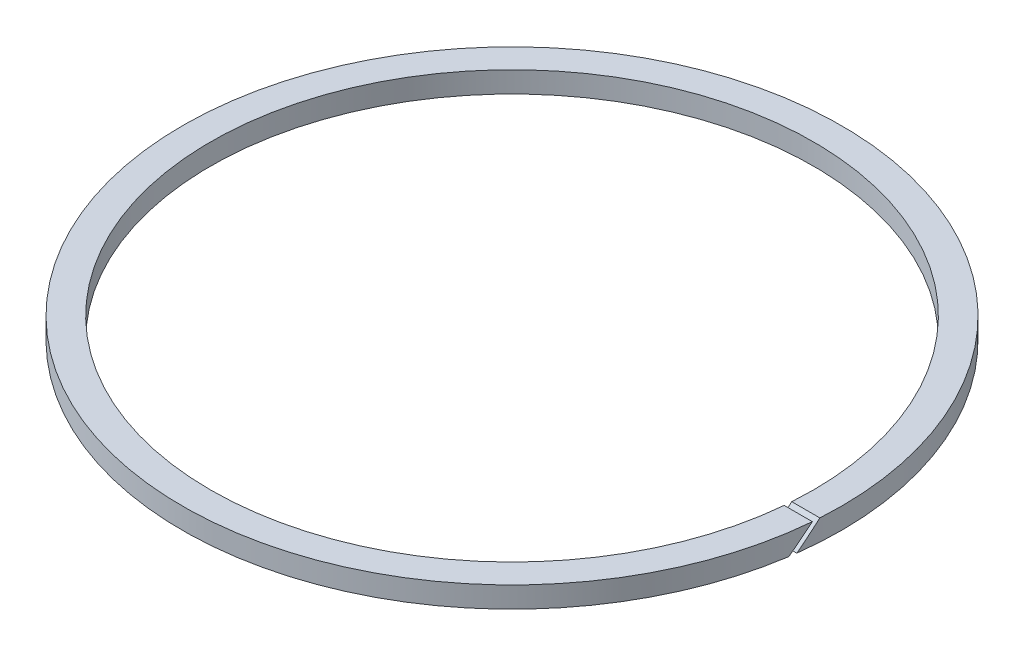
ISO-10303-21;
HEADER;
FILE_DESCRIPTION(('STEP AP214'),'2;1');
FILE_NAME('part.step','',(''),(''),'','','');
FILE_SCHEMA(('AUTOMOTIVE_DESIGN { 1 0 10303 214 1 1 1 1 }'));
ENDSEC;
DATA;
#1=APPLICATION_CONTEXT('core data for automotive mechanical design processes');
#2=APPLICATION_PROTOCOL_DEFINITION('international standard','automotive_design',2000,#1);
#3=PRODUCT_CONTEXT('',#1,'mechanical');
#4=PRODUCT('Part','Part','',(#3));
#5=PRODUCT_RELATED_PRODUCT_CATEGORY('part','',(#4));
#6=PRODUCT_DEFINITION_FORMATION('','',#4);
#7=PRODUCT_DEFINITION_CONTEXT('part definition',#1,'design');
#8=PRODUCT_DEFINITION('design','',#6,#7);
#9=PRODUCT_DEFINITION_SHAPE('','',#8);
#10=(LENGTH_UNIT() NAMED_UNIT(*) SI_UNIT(.MILLI.,.METRE.));
#11=(NAMED_UNIT(*) PLANE_ANGLE_UNIT() SI_UNIT($,.RADIAN.));
#12=(NAMED_UNIT(*) SI_UNIT($,.STERADIAN.) SOLID_ANGLE_UNIT());
#13=UNCERTAINTY_MEASURE_WITH_UNIT(LENGTH_MEASURE(1.E-05),#10,'distance_accuracy_value','');
#14=(GEOMETRIC_REPRESENTATION_CONTEXT(3) GLOBAL_UNCERTAINTY_ASSIGNED_CONTEXT((#13)) GLOBAL_UNIT_ASSIGNED_CONTEXT((#10,
#11,#12)) REPRESENTATION_CONTEXT('',''));
#15=CARTESIAN_POINT('',(0.,0.,0.));
#16=DIRECTION('',(0.,0.,1.));
#17=DIRECTION('',(1.,0.,0.));
#18=AXIS2_PLACEMENT_3D('',#15,#16,#17);
#19=CARTESIAN_POINT('',(0.,3.,0.));
#20=DIRECTION('',(0.,1.,0.));
#21=DIRECTION('',(0.,0.,1.));
#22=AXIS2_PLACEMENT_3D('',#19,#20,#21);
#23=PLANE('',#22);
#24=DIRECTION('',(1.,0.,0.));
#25=VECTOR('',#24,1.);
#26=CARTESIAN_POINT('',(37.,3.,3.));
#27=LINE('',#26,#25);
#28=CARTESIAN_POINT('',(42.8952211790545,3.,3.));
#29=VERTEX_POINT('',#28);
#30=CARTESIAN_POINT('',(46.9041575982343,3.,3.));
#31=VERTEX_POINT('',#30);
#32=EDGE_CURVE('E58',#29,#31,#27,.T.);
#33=ORIENTED_EDGE('',*,*,#32,.T.);
#34=CARTESIAN_POINT('',(0.,3.,0.));
#35=DIRECTION('',(0.,1.,0.));
#36=DIRECTION('',(0.,0.,1.));
#37=AXIS2_PLACEMENT_3D('',#34,#35,#36);
#38=CIRCLE('',#37,47.);
#39=CARTESIAN_POINT('',(46.8294778958724,3.,4.));
#40=VERTEX_POINT('',#39);
#41=EDGE_CURVE('E81',#31,#40,#38,.T.);
#42=ORIENTED_EDGE('',*,*,#41,.T.);
#43=DIRECTION('',(1.,0.,0.));
#44=VECTOR('',#43,1.);
#45=CARTESIAN_POINT('',(37.,3.,4.));
#46=LINE('',#45,#44);
#47=CARTESIAN_POINT('',(42.8135492572153,3.,4.));
#48=VERTEX_POINT('',#47);
#49=EDGE_CURVE('E75',#48,#40,#46,.T.);
#50=ORIENTED_EDGE('',*,*,#49,.F.);
#51=CARTESIAN_POINT('',(0.,3.,0.));
#52=DIRECTION('',(0.,1.,0.));
#53=DIRECTION('',(0.,0.,1.));
#54=AXIS2_PLACEMENT_3D('',#51,#52,#53);
#55=CIRCLE('',#54,43.);
#56=EDGE_CURVE('E85',#29,#48,#55,.T.);
#57=ORIENTED_EDGE('',*,*,#56,.F.);
#58=EDGE_LOOP('',(#33,#42,#50,#57));
#59=FACE_BOUND('',#58,.T.);
#60=ADVANCED_FACE('F36',(#59),#23,.T.);
#61=CARTESIAN_POINT('',(0.,0.,0.));
#62=DIRECTION('',(0.,1.,0.));
#63=DIRECTION('',(0.,0.,1.));
#64=AXIS2_PLACEMENT_3D('',#61,#62,#63);
#65=PLANE('',#64);
#66=CARTESIAN_POINT('',(0.,0.,0.));
#67=DIRECTION('',(0.,1.,0.));
#68=DIRECTION('',(0.,0.,1.));
#69=AXIS2_PLACEMENT_3D('',#66,#67,#68);
#70=CIRCLE('',#69,47.);
#71=CARTESIAN_POINT('',(46.6154480832267,0.,6.00000000000004));
#72=VERTEX_POINT('',#71);
#73=CARTESIAN_POINT('',(46.475800154489,0.,7.00000000000004));
#74=VERTEX_POINT('',#73);
#75=EDGE_CURVE('E89',#72,#74,#70,.T.);
#76=ORIENTED_EDGE('',*,*,#75,.F.);
#77=DIRECTION('',(1.,0.,0.));
#78=VECTOR('',#77,1.);
#79=CARTESIAN_POINT('',(37.,0.,6.00000000000004));
#80=LINE('',#79,#78);
#81=CARTESIAN_POINT('',(42.5793377120875,0.,6.00000000000004));
#82=VERTEX_POINT('',#81);
#83=EDGE_CURVE('E103',#82,#72,#80,.T.);
#84=ORIENTED_EDGE('',*,*,#83,.F.);
#85=CARTESIAN_POINT('',(0.,0.,0.));
#86=DIRECTION('',(0.,1.,0.));
#87=DIRECTION('',(0.,0.,1.));
#88=AXIS2_PLACEMENT_3D('',#85,#86,#87);
#89=CIRCLE('',#88,43.);
#90=CARTESIAN_POINT('',(42.4264068711929,0.,7.00000000000003));
#91=VERTEX_POINT('',#90);
#92=EDGE_CURVE('E90',#82,#91,#89,.T.);
#93=ORIENTED_EDGE('',*,*,#92,.T.);
#94=DIRECTION('',(1.,0.,0.));
#95=VECTOR('',#94,1.);
#96=CARTESIAN_POINT('',(37.,0.,7.00000000000004));
#97=LINE('',#96,#95);
#98=EDGE_CURVE('E51',#91,#74,#97,.T.);
#99=ORIENTED_EDGE('',*,*,#98,.T.);
#100=EDGE_LOOP('',(#76,#84,#93,#99));
#101=FACE_BOUND('',#100,.T.);
#102=ADVANCED_FACE('F108',(#101),#65,.F.);
#103=CARTESIAN_POINT('',(0.,3.,0.));
#104=DIRECTION('',(0.,-1.,0.));
#105=DIRECTION('',(0.,0.,-1.));
#106=AXIS2_PLACEMENT_3D('',#103,#104,#105);
#107=CYLINDRICAL_SURFACE('',#106,47.);
#108=ORIENTED_EDGE('',*,*,#41,.F.);
#109=CARTESIAN_POINT('',(0.,5.99999999999996,0.));
#110=DIRECTION('',(0.,-0.707106781186552,-0.707106781186543));
#111=DIRECTION('',(0.,-0.707106781186543,0.707106781186552));
#112=AXIS2_PLACEMENT_3D('',#109,#110,#111);
#113=ELLIPSE('',#112,66.4680374315351,47.);
#114=EDGE_CURVE('E94',#31,#72,#113,.T.);
#115=ORIENTED_EDGE('',*,*,#114,.T.);
#116=ORIENTED_EDGE('',*,*,#75,.T.);
#117=CARTESIAN_POINT('',(0.,6.99999999999996,0.));
#118=DIRECTION('',(0.,0.707106781186551,0.707106781186544));
#119=DIRECTION('',(0.,-0.707106781186544,0.707106781186551));
#120=AXIS2_PLACEMENT_3D('',#117,#118,#119);
#121=ELLIPSE('',#120,66.4680374315351,47.);
#122=EDGE_CURVE('E100',#74,#40,#121,.T.);
#123=ORIENTED_EDGE('',*,*,#122,.T.);
#124=EDGE_LOOP('',(#108,#115,#116,#123));
#125=FACE_BOUND('',#124,.T.);
#126=ADVANCED_FACE('F38',(#125),#107,.T.);
#127=CARTESIAN_POINT('',(0.,3.,0.));
#128=DIRECTION('',(0.,-1.,0.));
#129=DIRECTION('',(0.,0.,-1.));
#130=AXIS2_PLACEMENT_3D('',#127,#128,#129);
#131=CYLINDRICAL_SURFACE('',#130,43.);
#132=CARTESIAN_POINT('',(0.,5.99999999999996,0.));
#133=DIRECTION('',(0.,-0.707106781186552,-0.707106781186543));
#134=DIRECTION('',(0.,-0.707106781186543,0.707106781186552));
#135=AXIS2_PLACEMENT_3D('',#132,#133,#134);
#136=ELLIPSE('',#135,60.8111831820427,43.);
#137=EDGE_CURVE('E11',#29,#82,#136,.T.);
#138=ORIENTED_EDGE('',*,*,#137,.F.);
#139=ORIENTED_EDGE('',*,*,#56,.T.);
#140=CARTESIAN_POINT('',(0.,6.99999999999996,0.));
#141=DIRECTION('',(0.,0.707106781186551,0.707106781186544));
#142=DIRECTION('',(0.,-0.707106781186544,0.707106781186551));
#143=AXIS2_PLACEMENT_3D('',#140,#141,#142);
#144=ELLIPSE('',#143,60.8111831820428,43.);
#145=EDGE_CURVE('E44',#91,#48,#144,.T.);
#146=ORIENTED_EDGE('',*,*,#145,.F.);
#147=ORIENTED_EDGE('',*,*,#92,.F.);
#148=EDGE_LOOP('',(#138,#139,#146,#147));
#149=FACE_BOUND('',#148,.T.);
#150=ADVANCED_FACE('F88',(#149),#131,.F.);
#151=CARTESIAN_POINT('',(37.,3.,4.));
#152=DIRECTION('',(0.,0.707106781186551,0.707106781186544));
#153=DIRECTION('',(0.,-0.707106781186544,0.707106781186551));
#154=AXIS2_PLACEMENT_3D('',#151,#152,#153);
#155=PLANE('',#154);
#156=ORIENTED_EDGE('',*,*,#98,.F.);
#157=ORIENTED_EDGE('',*,*,#145,.T.);
#158=ORIENTED_EDGE('',*,*,#49,.T.);
#159=ORIENTED_EDGE('',*,*,#122,.F.);
#160=EDGE_LOOP('',(#156,#157,#158,#159));
#161=FACE_BOUND('',#160,.T.);
#162=ADVANCED_FACE('F74',(#161),#155,.F.);
#163=CARTESIAN_POINT('',(37.,3.,3.));
#164=DIRECTION('',(0.,-0.707106781186552,-0.707106781186543));
#165=DIRECTION('',(0.,0.707106781186543,-0.707106781186552));
#166=AXIS2_PLACEMENT_3D('',#163,#164,#165);
#167=PLANE('',#166);
#168=ORIENTED_EDGE('',*,*,#32,.F.);
#169=ORIENTED_EDGE('',*,*,#137,.T.);
#170=ORIENTED_EDGE('',*,*,#83,.T.);
#171=ORIENTED_EDGE('',*,*,#114,.F.);
#172=EDGE_LOOP('',(#168,#169,#170,#171));
#173=FACE_BOUND('',#172,.T.);
#174=ADVANCED_FACE('F110',(#173),#167,.F.);
#175=CLOSED_SHELL('',(#60,#102,#126,#150,#162,#174));
#176=MANIFOLD_SOLID_BREP('B2',#175);
#177=ADVANCED_BREP_SHAPE_REPRESENTATION('',(#18,#176),#14);
#178=SHAPE_DEFINITION_REPRESENTATION(#9,#177);
ENDSEC;
END-ISO-10303-21;
